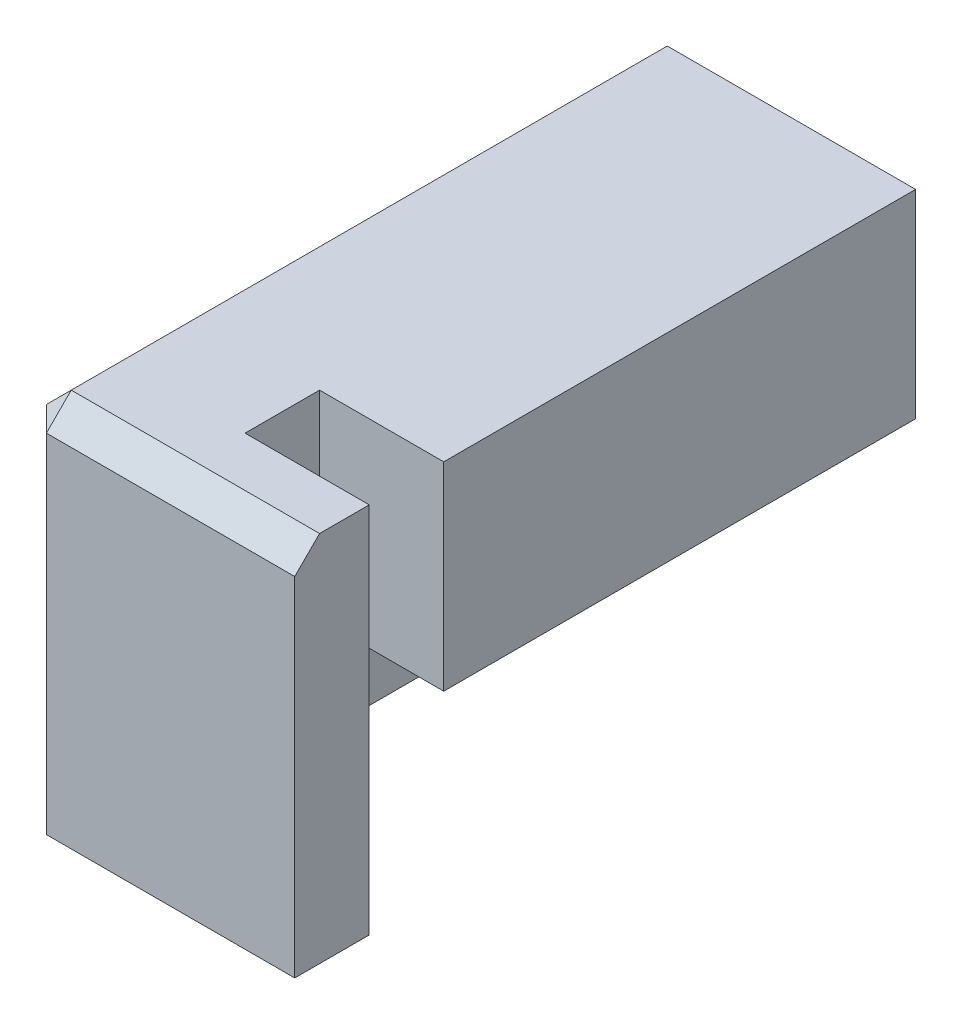
ISO-10303-21;
HEADER;
FILE_DESCRIPTION(('STEP AP214'),'2;1');
FILE_NAME('part.step','',(''),(''),'','','');
FILE_SCHEMA(('AUTOMOTIVE_DESIGN { 1 0 10303 214 1 1 1 1 }'));
ENDSEC;
DATA;
#1=APPLICATION_CONTEXT('core data for automotive mechanical design processes');
#2=APPLICATION_PROTOCOL_DEFINITION('international standard','automotive_design',2000,#1);
#3=PRODUCT_CONTEXT('',#1,'mechanical');
#4=PRODUCT('Part','Part','',(#3));
#5=PRODUCT_RELATED_PRODUCT_CATEGORY('part','',(#4));
#6=PRODUCT_DEFINITION_FORMATION('','',#4);
#7=PRODUCT_DEFINITION_CONTEXT('part definition',#1,'design');
#8=PRODUCT_DEFINITION('design','',#6,#7);
#9=PRODUCT_DEFINITION_SHAPE('','',#8);
#10=(LENGTH_UNIT() NAMED_UNIT(*) SI_UNIT(.MILLI.,.METRE.));
#11=(NAMED_UNIT(*) PLANE_ANGLE_UNIT() SI_UNIT($,.RADIAN.));
#12=(NAMED_UNIT(*) SI_UNIT($,.STERADIAN.) SOLID_ANGLE_UNIT());
#13=UNCERTAINTY_MEASURE_WITH_UNIT(LENGTH_MEASURE(1.E-05),#10,'distance_accuracy_value','');
#14=(GEOMETRIC_REPRESENTATION_CONTEXT(3) GLOBAL_UNCERTAINTY_ASSIGNED_CONTEXT((#13)) GLOBAL_UNIT_ASSIGNED_CONTEXT((#10,
#11,#12)) REPRESENTATION_CONTEXT('',''));
#15=CARTESIAN_POINT('',(0.,0.,0.));
#16=DIRECTION('',(0.,0.,1.));
#17=DIRECTION('',(1.,0.,0.));
#18=AXIS2_PLACEMENT_3D('',#15,#16,#17);
#19=CARTESIAN_POINT('',(0.,15.,3.));
#20=DIRECTION('',(-1.,0.,0.));
#21=DIRECTION('',(0.,0.,1.));
#22=AXIS2_PLACEMENT_3D('',#19,#20,#21);
#23=PLANE('',#22);
#24=DIRECTION('',(0.,0.,-1.));
#25=VECTOR('',#24,1.);
#26=CARTESIAN_POINT('',(0.,12.,-38.8223054515189));
#27=LINE('',#26,#25);
#28=CARTESIAN_POINT('',(0.,12.,3.));
#29=VERTEX_POINT('',#28);
#30=CARTESIAN_POINT('',(0.,12.,0.));
#31=VERTEX_POINT('',#30);
#32=EDGE_CURVE('E292',#29,#31,#27,.T.);
#33=ORIENTED_EDGE('',*,*,#32,.T.);
#34=DIRECTION('',(0.,-1.,0.));
#35=VECTOR('',#34,1.);
#36=CARTESIAN_POINT('',(0.,15.,0.));
#37=LINE('',#36,#35);
#38=CARTESIAN_POINT('',(0.,15.,0.));
#39=VERTEX_POINT('',#38);
#40=EDGE_CURVE('E235',#39,#31,#37,.T.);
#41=ORIENTED_EDGE('',*,*,#40,.F.);
#42=DIRECTION('',(0.,0.,-1.));
#43=VECTOR('',#42,1.);
#44=CARTESIAN_POINT('',(0.,15.,3.));
#45=LINE('',#44,#43);
#46=CARTESIAN_POINT('',(0.,15.,3.));
#47=VERTEX_POINT('',#46);
#48=EDGE_CURVE('E179',#47,#39,#45,.T.);
#49=ORIENTED_EDGE('',*,*,#48,.F.);
#50=DIRECTION('',(0.,-1.,0.));
#51=VECTOR('',#50,1.);
#52=CARTESIAN_POINT('',(0.,15.,3.));
#53=LINE('',#52,#51);
#54=EDGE_CURVE('E199',#47,#29,#53,.T.);
#55=ORIENTED_EDGE('',*,*,#54,.T.);
#56=EDGE_LOOP('',(#33,#41,#49,#55));
#57=FACE_BOUND('',#56,.T.);
#58=ADVANCED_FACE('F43',(#57),#23,.F.);
#59=CARTESIAN_POINT('',(0.,15.,0.));
#60=DIRECTION('',(0.,0.,-1.));
#61=DIRECTION('',(-1.,0.,0.));
#62=AXIS2_PLACEMENT_3D('',#59,#60,#61);
#63=PLANE('',#62);
#64=DIRECTION('',(0.,-1.,0.));
#65=VECTOR('',#64,1.);
#66=CARTESIAN_POINT('',(0.,15.,0.));
#67=LINE('',#66,#65);
#68=CARTESIAN_POINT('',(0.,7.,0.));
#69=VERTEX_POINT('',#68);
#70=EDGE_CURVE('E167',#31,#69,#67,.T.);
#71=ORIENTED_EDGE('',*,*,#70,.T.);
#72=DIRECTION('',(1.,0.,0.));
#73=VECTOR('',#72,1.);
#74=CARTESIAN_POINT('',(0.,7.,0.));
#75=LINE('',#74,#73);
#76=CARTESIAN_POINT('',(5.,7.,0.));
#77=VERTEX_POINT('',#76);
#78=EDGE_CURVE('E60',#69,#77,#75,.T.);
#79=ORIENTED_EDGE('',*,*,#78,.T.);
#80=DIRECTION('',(0.,-1.,0.));
#81=VECTOR('',#80,1.);
#82=CARTESIAN_POINT('',(5.,15.,0.));
#83=LINE('',#82,#81);
#84=CARTESIAN_POINT('',(5.,15.,0.));
#85=VERTEX_POINT('',#84);
#86=EDGE_CURVE('E231',#85,#77,#83,.T.);
#87=ORIENTED_EDGE('',*,*,#86,.F.);
#88=DIRECTION('',(1.,0.,0.));
#89=VECTOR('',#88,1.);
#90=CARTESIAN_POINT('',(0.,15.,0.));
#91=LINE('',#90,#89);
#92=EDGE_CURVE('E183',#39,#85,#91,.T.);
#93=ORIENTED_EDGE('',*,*,#92,.F.);
#94=ORIENTED_EDGE('',*,*,#40,.T.);
#95=EDGE_LOOP('',(#71,#79,#87,#93,#94));
#96=FACE_BOUND('',#95,.T.);
#97=ADVANCED_FACE('F316',(#96),#63,.F.);
#98=CARTESIAN_POINT('',(5.,15.,0.));
#99=DIRECTION('',(-1.,0.,0.));
#100=DIRECTION('',(0.,0.,1.));
#101=AXIS2_PLACEMENT_3D('',#98,#99,#100);
#102=PLANE('',#101);
#103=ORIENTED_EDGE('',*,*,#86,.T.);
#104=DIRECTION('',(0.,0.,-1.));
#105=VECTOR('',#104,1.);
#106=CARTESIAN_POINT('',(5.,7.,0.));
#107=LINE('',#106,#105);
#108=CARTESIAN_POINT('',(5.,7.,-19.));
#109=VERTEX_POINT('',#108);
#110=EDGE_CURVE('E160',#77,#109,#107,.T.);
#111=ORIENTED_EDGE('',*,*,#110,.T.);
#112=DIRECTION('',(0.,-1.,0.));
#113=VECTOR('',#112,1.);
#114=CARTESIAN_POINT('',(5.,15.,-19.));
#115=LINE('',#114,#113);
#116=CARTESIAN_POINT('',(5.,15.,-19.));
#117=VERTEX_POINT('',#116);
#118=EDGE_CURVE('E158',#117,#109,#115,.T.);
#119=ORIENTED_EDGE('',*,*,#118,.F.);
#120=DIRECTION('',(0.,0.,-1.));
#121=VECTOR('',#120,1.);
#122=CARTESIAN_POINT('',(5.,15.,0.));
#123=LINE('',#122,#121);
#124=EDGE_CURVE('E187',#85,#117,#123,.T.);
#125=ORIENTED_EDGE('',*,*,#124,.F.);
#126=EDGE_LOOP('',(#103,#111,#119,#125));
#127=FACE_BOUND('',#126,.T.);
#128=ADVANCED_FACE('F312',(#127),#102,.F.);
#129=CARTESIAN_POINT('',(5.,15.,-19.));
#130=DIRECTION('',(0.,0.,1.));
#131=DIRECTION('',(1.,0.,0.));
#132=AXIS2_PLACEMENT_3D('',#129,#130,#131);
#133=PLANE('',#132);
#134=ORIENTED_EDGE('',*,*,#118,.T.);
#135=DIRECTION('',(1.,0.,0.));
#136=VECTOR('',#135,1.);
#137=CARTESIAN_POINT('',(5.69612524344569,7.,-19.));
#138=LINE('',#137,#136);
#139=CARTESIAN_POINT('',(0.,7.,-19.));
#140=VERTEX_POINT('',#139);
#141=EDGE_CURVE('E145',#140,#109,#138,.T.);
#142=ORIENTED_EDGE('',*,*,#141,.F.);
#143=DIRECTION('',(0.,1.,0.));
#144=VECTOR('',#143,1.);
#145=CARTESIAN_POINT('',(0.,15.,-19.));
#146=LINE('',#145,#144);
#147=CARTESIAN_POINT('',(0.,12.,-19.));
#148=VERTEX_POINT('',#147);
#149=EDGE_CURVE('E154',#140,#148,#146,.T.);
#150=ORIENTED_EDGE('',*,*,#149,.T.);
#151=DIRECTION('',(1.,0.,0.));
#152=VECTOR('',#151,1.);
#153=CARTESIAN_POINT('',(5.,12.,-19.));
#154=LINE('',#153,#152);
#155=CARTESIAN_POINT('',(-3.,12.,-19.));
#156=VERTEX_POINT('',#155);
#157=EDGE_CURVE('E239',#156,#148,#154,.T.);
#158=ORIENTED_EDGE('',*,*,#157,.F.);
#159=DIRECTION('',(0.,-1.,0.));
#160=VECTOR('',#159,1.);
#161=CARTESIAN_POINT('',(-3.,15.,-19.));
#162=LINE('',#161,#160);
#163=CARTESIAN_POINT('',(-3.,0.,-19.));
#164=VERTEX_POINT('',#163);
#165=EDGE_CURVE('E168',#156,#164,#162,.T.);
#166=ORIENTED_EDGE('',*,*,#165,.T.);
#167=DIRECTION('',(-1.,0.,0.));
#168=VECTOR('',#167,1.);
#169=CARTESIAN_POINT('',(5.,0.,-19.));
#170=LINE('',#169,#168);
#171=CARTESIAN_POINT('',(-6.,0.,-19.));
#172=VERTEX_POINT('',#171);
#173=EDGE_CURVE('E172',#164,#172,#170,.T.);
#174=ORIENTED_EDGE('',*,*,#173,.T.);
#175=DIRECTION('',(0.,-1.,0.));
#176=VECTOR('',#175,1.);
#177=CARTESIAN_POINT('',(-6.,15.,-19.));
#178=LINE('',#177,#176);
#179=CARTESIAN_POINT('',(-6.,14.,-19.));
#180=VERTEX_POINT('',#179);
#181=EDGE_CURVE('E226',#180,#172,#178,.T.);
#182=ORIENTED_EDGE('',*,*,#181,.F.);
#183=DIRECTION('',(-0.707106781186546,-0.707106781186549,0.));
#184=VECTOR('',#183,1.);
#185=CARTESIAN_POINT('',(-5.,15.,-19.));
#186=LINE('',#185,#184);
#187=CARTESIAN_POINT('',(-5.,15.,-19.));
#188=VERTEX_POINT('',#187);
#189=EDGE_CURVE('E53',#180,#188,#186,.F.);
#190=ORIENTED_EDGE('',*,*,#189,.T.);
#191=DIRECTION('',(-1.,0.,0.));
#192=VECTOR('',#191,1.);
#193=CARTESIAN_POINT('',(5.,15.,-19.));
#194=LINE('',#193,#192);
#195=EDGE_CURVE('E190',#117,#188,#194,.T.);
#196=ORIENTED_EDGE('',*,*,#195,.F.);
#197=EDGE_LOOP('',(#134,#142,#150,#158,#166,#174,#182,#190,#196));
#198=FACE_BOUND('',#197,.T.);
#199=ADVANCED_FACE('F152',(#198),#133,.F.);
#200=CARTESIAN_POINT('',(-6.,15.,-19.));
#201=DIRECTION('',(1.,0.,0.));
#202=DIRECTION('',(0.,0.,-1.));
#203=AXIS2_PLACEMENT_3D('',#200,#201,#202);
#204=PLANE('',#203);
#205=DIRECTION('',(0.,0.,1.));
#206=VECTOR('',#205,1.);
#207=CARTESIAN_POINT('',(-6.,0.,-19.));
#208=LINE('',#207,#206);
#209=CARTESIAN_POINT('',(-6.,0.,5.));
#210=VERTEX_POINT('',#209);
#211=EDGE_CURVE('E203',#172,#210,#208,.T.);
#212=ORIENTED_EDGE('',*,*,#211,.T.);
#213=DIRECTION('',(0.,1.,0.));
#214=VECTOR('',#213,1.);
#215=CARTESIAN_POINT('',(-6.,15.,5.));
#216=LINE('',#215,#214);
#217=CARTESIAN_POINT('',(-6.,14.,5.));
#218=VERTEX_POINT('',#217);
#219=EDGE_CURVE('E255',#210,#218,#216,.T.);
#220=ORIENTED_EDGE('',*,*,#219,.T.);
#221=DIRECTION('',(0.,0.,-1.));
#222=VECTOR('',#221,1.);
#223=CARTESIAN_POINT('',(-6.,14.,-19.));
#224=LINE('',#223,#222);
#225=EDGE_CURVE('E252',#218,#180,#224,.T.);
#226=ORIENTED_EDGE('',*,*,#225,.T.);
#227=ORIENTED_EDGE('',*,*,#181,.T.);
#228=EDGE_LOOP('',(#212,#220,#226,#227));
#229=FACE_BOUND('',#228,.T.);
#230=ADVANCED_FACE('F328',(#229),#204,.F.);
#231=CARTESIAN_POINT('',(-6.,15.,6.));
#232=DIRECTION('',(0.,0.,-1.));
#233=DIRECTION('',(-1.,0.,0.));
#234=AXIS2_PLACEMENT_3D('',#231,#232,#233);
#235=PLANE('',#234);
#236=DIRECTION('',(-1.,0.,0.));
#237=VECTOR('',#236,1.);
#238=CARTESIAN_POINT('',(-6.,14.,6.));
#239=LINE('',#238,#237);
#240=CARTESIAN_POINT('',(5.,14.,6.));
#241=VERTEX_POINT('',#240);
#242=CARTESIAN_POINT('',(-5.,14.,6.));
#243=VERTEX_POINT('',#242);
#244=EDGE_CURVE('E242',#241,#243,#239,.T.);
#245=ORIENTED_EDGE('',*,*,#244,.T.);
#246=DIRECTION('',(0.,-1.,0.));
#247=VECTOR('',#246,1.);
#248=CARTESIAN_POINT('',(-5.,15.,6.));
#249=LINE('',#248,#247);
#250=CARTESIAN_POINT('',(-5.,0.,6.));
#251=VERTEX_POINT('',#250);
#252=EDGE_CURVE('E245',#243,#251,#249,.T.);
#253=ORIENTED_EDGE('',*,*,#252,.T.);
#254=DIRECTION('',(1.,0.,0.));
#255=VECTOR('',#254,1.);
#256=CARTESIAN_POINT('',(-6.,0.,6.));
#257=LINE('',#256,#255);
#258=CARTESIAN_POINT('',(5.,0.,6.));
#259=VERTEX_POINT('',#258);
#260=EDGE_CURVE('E207',#251,#259,#257,.T.);
#261=ORIENTED_EDGE('',*,*,#260,.T.);
#262=DIRECTION('',(0.,-1.,0.));
#263=VECTOR('',#262,1.);
#264=CARTESIAN_POINT('',(5.,15.,6.));
#265=LINE('',#264,#263);
#266=EDGE_CURVE('E223',#241,#259,#265,.T.);
#267=ORIENTED_EDGE('',*,*,#266,.F.);
#268=EDGE_LOOP('',(#245,#253,#261,#267));
#269=FACE_BOUND('',#268,.T.);
#270=ADVANCED_FACE('F391',(#269),#235,.F.);
#271=CARTESIAN_POINT('',(5.,15.,6.));
#272=DIRECTION('',(-1.,0.,0.));
#273=DIRECTION('',(0.,0.,1.));
#274=AXIS2_PLACEMENT_3D('',#271,#272,#273);
#275=PLANE('',#274);
#276=DIRECTION('',(0.,0.,-1.));
#277=VECTOR('',#276,1.);
#278=CARTESIAN_POINT('',(5.,15.,6.));
#279=LINE('',#278,#277);
#280=CARTESIAN_POINT('',(5.00000000000001,15.,5.));
#281=VERTEX_POINT('',#280);
#282=CARTESIAN_POINT('',(5.00000000000001,15.,3.));
#283=VERTEX_POINT('',#282);
#284=EDGE_CURVE('E193',#281,#283,#279,.T.);
#285=ORIENTED_EDGE('',*,*,#284,.F.);
#286=DIRECTION('',(0.,0.707106781186549,-0.707106781186546));
#287=VECTOR('',#286,1.);
#288=CARTESIAN_POINT('',(5.00000000000001,15.,5.));
#289=LINE('',#288,#287);
#290=EDGE_CURVE('E263',#281,#241,#289,.F.);
#291=ORIENTED_EDGE('',*,*,#290,.T.);
#292=ORIENTED_EDGE('',*,*,#266,.T.);
#293=DIRECTION('',(0.,0.,-1.));
#294=VECTOR('',#293,1.);
#295=CARTESIAN_POINT('',(5.,0.,6.));
#296=LINE('',#295,#294);
#297=CARTESIAN_POINT('',(5.00000000000001,0.,3.));
#298=VERTEX_POINT('',#297);
#299=EDGE_CURVE('E211',#259,#298,#296,.T.);
#300=ORIENTED_EDGE('',*,*,#299,.T.);
#301=DIRECTION('',(0.,-1.,0.));
#302=VECTOR('',#301,1.);
#303=CARTESIAN_POINT('',(5.00000000000001,15.,3.));
#304=LINE('',#303,#302);
#305=EDGE_CURVE('E220',#283,#298,#304,.T.);
#306=ORIENTED_EDGE('',*,*,#305,.F.);
#307=EDGE_LOOP('',(#285,#291,#292,#300,#306));
#308=FACE_BOUND('',#307,.T.);
#309=ADVANCED_FACE('F388',(#308),#275,.F.);
#310=CARTESIAN_POINT('',(5.00000000000001,15.,3.));
#311=DIRECTION('',(0.,0.,1.));
#312=DIRECTION('',(1.,0.,0.));
#313=AXIS2_PLACEMENT_3D('',#310,#311,#312);
#314=PLANE('',#313);
#315=ORIENTED_EDGE('',*,*,#305,.T.);
#316=DIRECTION('',(-1.,0.,0.));
#317=VECTOR('',#316,1.);
#318=CARTESIAN_POINT('',(5.00000000000001,0.,3.));
#319=LINE('',#318,#317);
#320=CARTESIAN_POINT('',(-3.,0.,3.));
#321=VERTEX_POINT('',#320);
#322=EDGE_CURVE('E184',#298,#321,#319,.T.);
#323=ORIENTED_EDGE('',*,*,#322,.T.);
#324=DIRECTION('',(0.,-1.,0.));
#325=VECTOR('',#324,1.);
#326=CARTESIAN_POINT('',(-3.,56.9297654808627,3.));
#327=LINE('',#326,#325);
#328=CARTESIAN_POINT('',(-3.,12.,3.));
#329=VERTEX_POINT('',#328);
#330=EDGE_CURVE('E283',#329,#321,#327,.T.);
#331=ORIENTED_EDGE('',*,*,#330,.F.);
#332=DIRECTION('',(1.,0.,0.));
#333=VECTOR('',#332,1.);
#334=CARTESIAN_POINT('',(-3.,12.,3.));
#335=LINE('',#334,#333);
#336=EDGE_CURVE('E175',#329,#29,#335,.T.);
#337=ORIENTED_EDGE('',*,*,#336,.T.);
#338=ORIENTED_EDGE('',*,*,#54,.F.);
#339=DIRECTION('',(-1.,0.,0.));
#340=VECTOR('',#339,1.);
#341=CARTESIAN_POINT('',(5.00000000000001,15.,3.));
#342=LINE('',#341,#340);
#343=EDGE_CURVE('E196',#283,#47,#342,.T.);
#344=ORIENTED_EDGE('',*,*,#343,.F.);
#345=EDGE_LOOP('',(#315,#323,#331,#337,#338,#344));
#346=FACE_BOUND('',#345,.T.);
#347=ADVANCED_FACE('F383',(#346),#314,.F.);
#348=CARTESIAN_POINT('',(0.,15.,0.));
#349=DIRECTION('',(0.,-1.,0.));
#350=DIRECTION('',(0.,0.,-1.));
#351=AXIS2_PLACEMENT_3D('',#348,#349,#350);
#352=PLANE('',#351);
#353=DIRECTION('',(0.,0.,1.));
#354=VECTOR('',#353,1.);
#355=CARTESIAN_POINT('',(-5.,15.,0.));
#356=LINE('',#355,#354);
#357=CARTESIAN_POINT('',(-5.,15.,5.));
#358=VERTEX_POINT('',#357);
#359=EDGE_CURVE('E67',#188,#358,#356,.T.);
#360=ORIENTED_EDGE('',*,*,#359,.T.);
#361=DIRECTION('',(1.,0.,0.));
#362=VECTOR('',#361,1.);
#363=CARTESIAN_POINT('',(0.,15.,5.));
#364=LINE('',#363,#362);
#365=EDGE_CURVE('E260',#358,#281,#364,.T.);
#366=ORIENTED_EDGE('',*,*,#365,.T.);
#367=ORIENTED_EDGE('',*,*,#284,.T.);
#368=ORIENTED_EDGE('',*,*,#343,.T.);
#369=ORIENTED_EDGE('',*,*,#48,.T.);
#370=ORIENTED_EDGE('',*,*,#92,.T.);
#371=ORIENTED_EDGE('',*,*,#124,.T.);
#372=ORIENTED_EDGE('',*,*,#195,.T.);
#373=EDGE_LOOP('',(#360,#366,#367,#368,#369,#370,#371,#372));
#374=FACE_BOUND('',#373,.T.);
#375=ADVANCED_FACE('F342',(#374),#352,.F.);
#376=CARTESIAN_POINT('',(0.,0.,0.));
#377=DIRECTION('',(0.,-1.,0.));
#378=DIRECTION('',(0.,0.,-1.));
#379=AXIS2_PLACEMENT_3D('',#376,#377,#378);
#380=PLANE('',#379);
#381=ORIENTED_EDGE('',*,*,#260,.F.);
#382=DIRECTION('',(0.707106781186546,0.,0.707106781186549));
#383=VECTOR('',#382,1.);
#384=CARTESIAN_POINT('',(-5.50000000000001,0.,5.49999999999999));
#385=LINE('',#384,#383);
#386=EDGE_CURVE('E249',#251,#210,#385,.F.);
#387=ORIENTED_EDGE('',*,*,#386,.T.);
#388=ORIENTED_EDGE('',*,*,#211,.F.);
#389=ORIENTED_EDGE('',*,*,#173,.F.);
#390=DIRECTION('',(0.,0.,-1.));
#391=VECTOR('',#390,1.);
#392=CARTESIAN_POINT('',(-3.,0.,-38.8223054515189));
#393=LINE('',#392,#391);
#394=EDGE_CURVE('E278',#321,#164,#393,.T.);
#395=ORIENTED_EDGE('',*,*,#394,.F.);
#396=ORIENTED_EDGE('',*,*,#322,.F.);
#397=ORIENTED_EDGE('',*,*,#299,.F.);
#398=EDGE_LOOP('',(#381,#387,#388,#389,#395,#396,#397));
#399=FACE_BOUND('',#398,.T.);
#400=ADVANCED_FACE('F324',(#399),#380,.T.);
#401=CARTESIAN_POINT('',(0.,12.,0.));
#402=DIRECTION('',(0.,-1.,0.));
#403=DIRECTION('',(0.,0.,-1.));
#404=AXIS2_PLACEMENT_3D('',#401,#402,#403);
#405=PLANE('',#404);
#406=ORIENTED_EDGE('',*,*,#157,.T.);
#407=EDGE_CURVE('E165',#31,#148,#27,.T.);
#408=ORIENTED_EDGE('',*,*,#407,.F.);
#409=ORIENTED_EDGE('',*,*,#32,.F.);
#410=ORIENTED_EDGE('',*,*,#336,.F.);
#411=DIRECTION('',(0.,0.,1.));
#412=VECTOR('',#411,1.);
#413=CARTESIAN_POINT('',(-3.,12.,-38.8223054515189));
#414=LINE('',#413,#412);
#415=EDGE_CURVE('E289',#156,#329,#414,.T.);
#416=ORIENTED_EDGE('',*,*,#415,.F.);
#417=EDGE_LOOP('',(#406,#408,#409,#410,#416));
#418=FACE_BOUND('',#417,.T.);
#419=ADVANCED_FACE('F318',(#418),#405,.T.);
#420=CARTESIAN_POINT('',(0.,56.9297654808627,-38.8223054515189));
#421=DIRECTION('',(1.,0.,0.));
#422=DIRECTION('',(0.,0.,-1.));
#423=AXIS2_PLACEMENT_3D('',#420,#421,#422);
#424=PLANE('',#423);
#425=ORIENTED_EDGE('',*,*,#149,.F.);
#426=DIRECTION('',(0.,0.,1.));
#427=VECTOR('',#426,1.);
#428=CARTESIAN_POINT('',(0.,7.,-38.8223054515189));
#429=LINE('',#428,#427);
#430=EDGE_CURVE('E12',#140,#69,#429,.T.);
#431=ORIENTED_EDGE('',*,*,#430,.T.);
#432=ORIENTED_EDGE('',*,*,#70,.F.);
#433=ORIENTED_EDGE('',*,*,#407,.T.);
#434=EDGE_LOOP('',(#425,#431,#432,#433));
#435=FACE_BOUND('',#434,.T.);
#436=ADVANCED_FACE('F163',(#435),#424,.F.);
#437=CARTESIAN_POINT('',(-3.,56.9297654808627,-38.8223054515189));
#438=DIRECTION('',(-1.,0.,0.));
#439=DIRECTION('',(0.,0.,1.));
#440=AXIS2_PLACEMENT_3D('',#437,#438,#439);
#441=PLANE('',#440);
#442=ORIENTED_EDGE('',*,*,#415,.T.);
#443=ORIENTED_EDGE('',*,*,#330,.T.);
#444=ORIENTED_EDGE('',*,*,#394,.T.);
#445=ORIENTED_EDGE('',*,*,#165,.F.);
#446=EDGE_LOOP('',(#442,#443,#444,#445));
#447=FACE_BOUND('',#446,.T.);
#448=ADVANCED_FACE('F369',(#447),#441,.F.);
#449=CARTESIAN_POINT('',(-5.,15.,0.));
#450=DIRECTION('',(0.707106781186549,-0.707106781186546,0.));
#451=DIRECTION('',(0.,0.,1.));
#452=AXIS2_PLACEMENT_3D('',#449,#450,#451);
#453=PLANE('',#452);
#454=ORIENTED_EDGE('',*,*,#189,.F.);
#455=ORIENTED_EDGE('',*,*,#225,.F.);
#456=DIRECTION('',(0.707106781186546,0.707106781186549,0.));
#457=VECTOR('',#456,1.);
#458=CARTESIAN_POINT('',(-6.,14.,5.));
#459=LINE('',#458,#457);
#460=EDGE_CURVE('E275',#358,#218,#459,.F.);
#461=ORIENTED_EDGE('',*,*,#460,.F.);
#462=ORIENTED_EDGE('',*,*,#359,.F.);
#463=EDGE_LOOP('',(#454,#455,#461,#462));
#464=FACE_BOUND('',#463,.T.);
#465=ADVANCED_FACE('F46',(#464),#453,.F.);
#466=CARTESIAN_POINT('',(0.,15.,5.));
#467=DIRECTION('',(0.,-0.707106781186546,-0.707106781186549));
#468=DIRECTION('',(1.,0.,0.));
#469=AXIS2_PLACEMENT_3D('',#466,#467,#468);
#470=PLANE('',#469);
#471=ORIENTED_EDGE('',*,*,#290,.F.);
#472=ORIENTED_EDGE('',*,*,#365,.F.);
#473=DIRECTION('',(0.,-0.707106781186549,0.707106781186546));
#474=VECTOR('',#473,1.);
#475=CARTESIAN_POINT('',(-5.,14.5,5.5));
#476=LINE('',#475,#474);
#477=EDGE_CURVE('E272',#243,#358,#476,.F.);
#478=ORIENTED_EDGE('',*,*,#477,.F.);
#479=ORIENTED_EDGE('',*,*,#244,.F.);
#480=EDGE_LOOP('',(#471,#472,#478,#479));
#481=FACE_BOUND('',#480,.T.);
#482=ADVANCED_FACE('F338',(#481),#470,.F.);
#483=CARTESIAN_POINT('',(-6.,14.,5.));
#484=DIRECTION('',(-0.577350269189628,0.577350269189624,0.577350269189626));
#485=DIRECTION('',(0.707106781186546,0.,0.707106781186549));
#486=AXIS2_PLACEMENT_3D('',#483,#484,#485);
#487=PLANE('',#486);
#488=ORIENTED_EDGE('',*,*,#477,.T.);
#489=ORIENTED_EDGE('',*,*,#460,.T.);
#490=DIRECTION('',(-0.707106781186546,0.,-0.707106781186549));
#491=VECTOR('',#490,1.);
#492=CARTESIAN_POINT('',(-6.,14.,5.));
#493=LINE('',#492,#491);
#494=EDGE_CURVE('E268',#243,#218,#493,.T.);
#495=ORIENTED_EDGE('',*,*,#494,.F.);
#496=EDGE_LOOP('',(#488,#489,#495));
#497=FACE_BOUND('',#496,.T.);
#498=ADVANCED_FACE('F333',(#497),#487,.T.);
#499=CARTESIAN_POINT('',(-5.,15.,6.));
#500=DIRECTION('',(0.707106781186549,0.,-0.707106781186546));
#501=DIRECTION('',(0.,-1.,0.));
#502=AXIS2_PLACEMENT_3D('',#499,#500,#501);
#503=PLANE('',#502);
#504=ORIENTED_EDGE('',*,*,#494,.T.);
#505=ORIENTED_EDGE('',*,*,#219,.F.);
#506=ORIENTED_EDGE('',*,*,#386,.F.);
#507=ORIENTED_EDGE('',*,*,#252,.F.);
#508=EDGE_LOOP('',(#504,#505,#506,#507));
#509=FACE_BOUND('',#508,.T.);
#510=ADVANCED_FACE('F331',(#509),#503,.F.);
#511=CARTESIAN_POINT('',(5.69612524344569,7.,15.4150652122024));
#512=DIRECTION('',(0.,1.,0.));
#513=DIRECTION('',(0.,0.,1.));
#514=AXIS2_PLACEMENT_3D('',#511,#512,#513);
#515=PLANE('',#514);
#516=ORIENTED_EDGE('',*,*,#430,.F.);
#517=ORIENTED_EDGE('',*,*,#141,.T.);
#518=ORIENTED_EDGE('',*,*,#110,.F.);
#519=ORIENTED_EDGE('',*,*,#78,.F.);
#520=EDGE_LOOP('',(#516,#517,#518,#519));
#521=FACE_BOUND('',#520,.T.);
#522=ADVANCED_FACE('F144',(#521),#515,.F.);
#523=CLOSED_SHELL('',(#58,#97,#128,#199,#230,#270,#309,#347,#375,#400,#419,#436,#448,#465,#482,
#498,#510,#522));
#524=MANIFOLD_SOLID_BREP('B2',#523);
#525=ADVANCED_BREP_SHAPE_REPRESENTATION('',(#18,#524),#14);
#526=SHAPE_DEFINITION_REPRESENTATION(#9,#525);
ENDSEC;
END-ISO-10303-21;
